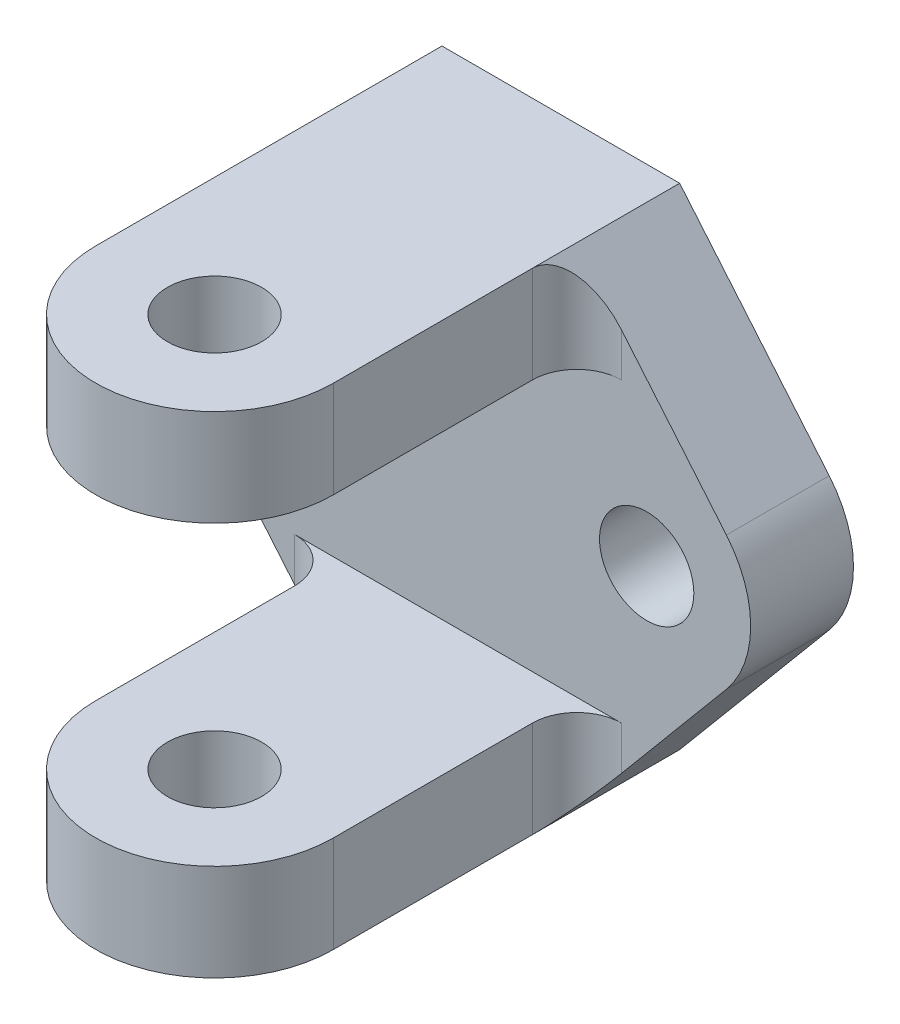
ISO-10303-21;
HEADER;
FILE_DESCRIPTION(('STEP AP214'),'2;1');
FILE_NAME('part.step','',(''),(''),'','','');
FILE_SCHEMA(('AUTOMOTIVE_DESIGN { 1 0 10303 214 1 1 1 1 }'));
ENDSEC;
DATA;
#1=APPLICATION_CONTEXT('core data for automotive mechanical design processes');
#2=APPLICATION_PROTOCOL_DEFINITION('international standard','automotive_design',2000,#1);
#3=PRODUCT_CONTEXT('',#1,'mechanical');
#4=PRODUCT('Part','Part','',(#3));
#5=PRODUCT_RELATED_PRODUCT_CATEGORY('part','',(#4));
#6=PRODUCT_DEFINITION_FORMATION('','',#4);
#7=PRODUCT_DEFINITION_CONTEXT('part definition',#1,'design');
#8=PRODUCT_DEFINITION('design','',#6,#7);
#9=PRODUCT_DEFINITION_SHAPE('','',#8);
#10=(LENGTH_UNIT() NAMED_UNIT(*) SI_UNIT(.MILLI.,.METRE.));
#11=(NAMED_UNIT(*) PLANE_ANGLE_UNIT() SI_UNIT($,.RADIAN.));
#12=(NAMED_UNIT(*) SI_UNIT($,.STERADIAN.) SOLID_ANGLE_UNIT());
#13=UNCERTAINTY_MEASURE_WITH_UNIT(LENGTH_MEASURE(1.E-05),#10,'distance_accuracy_value','');
#14=(GEOMETRIC_REPRESENTATION_CONTEXT(3) GLOBAL_UNCERTAINTY_ASSIGNED_CONTEXT((#13)) GLOBAL_UNIT_ASSIGNED_CONTEXT((#10,
#11,#12)) REPRESENTATION_CONTEXT('',''));
#15=CARTESIAN_POINT('',(0.,0.,0.));
#16=DIRECTION('',(0.,0.,1.));
#17=DIRECTION('',(1.,0.,0.));
#18=AXIS2_PLACEMENT_3D('',#15,#16,#17);
#19=CARTESIAN_POINT('',(-8.,-83.7629553253982,0.));
#20=DIRECTION('',(1.,0.,0.));
#21=DIRECTION('',(0.,0.,-1.));
#22=AXIS2_PLACEMENT_3D('',#19,#20,#21);
#23=PLANE('',#22);
#24=DIRECTION('',(0.,0.,1.));
#25=VECTOR('',#24,1.);
#26=CARTESIAN_POINT('',(-8.,16.51,0.));
#27=LINE('',#26,#25);
#28=CARTESIAN_POINT('',(-8.,16.51,12.46));
#29=VERTEX_POINT('',#28);
#30=CARTESIAN_POINT('',(-8.,16.51,25.8481308));
#31=VERTEX_POINT('',#30);
#32=EDGE_CURVE('E149',#29,#31,#27,.T.);
#33=ORIENTED_EDGE('',*,*,#32,.F.);
#34=DIRECTION('',(0.,1.,0.));
#35=VECTOR('',#34,1.);
#36=CARTESIAN_POINT('',(-8.,9.99999999999999,12.46));
#37=LINE('',#36,#35);
#38=CARTESIAN_POINT('',(-8.,10.,12.46));
#39=VERTEX_POINT('',#38);
#40=EDGE_CURVE('E142',#29,#39,#37,.F.);
#41=ORIENTED_EDGE('',*,*,#40,.T.);
#42=DIRECTION('',(0.,0.,-1.));
#43=VECTOR('',#42,1.);
#44=CARTESIAN_POINT('',(-7.99999999999999,10.,62.46));
#45=LINE('',#44,#43);
#46=CARTESIAN_POINT('',(-8.,9.99999999999999,25.8481308));
#47=VERTEX_POINT('',#46);
#48=EDGE_CURVE('E146',#47,#39,#45,.T.);
#49=ORIENTED_EDGE('',*,*,#48,.F.);
#50=DIRECTION('',(0.,1.,0.));
#51=VECTOR('',#50,1.);
#52=CARTESIAN_POINT('',(-8.,-83.7629553253982,25.8481308));
#53=LINE('',#52,#51);
#54=EDGE_CURVE('E295',#47,#31,#53,.T.);
#55=ORIENTED_EDGE('',*,*,#54,.T.);
#56=EDGE_LOOP('',(#33,#41,#49,#55));
#57=FACE_BOUND('',#56,.T.);
#58=ADVANCED_FACE('F42',(#57),#23,.F.);
#59=CARTESIAN_POINT('',(8.,-83.7629553253982,0.));
#60=DIRECTION('',(1.,0.,0.));
#61=DIRECTION('',(0.,0.,-1.));
#62=AXIS2_PLACEMENT_3D('',#59,#60,#61);
#63=PLANE('',#62);
#64=DIRECTION('',(0.,0.,-1.));
#65=VECTOR('',#64,1.);
#66=CARTESIAN_POINT('',(8.,10.,62.46));
#67=LINE('',#66,#65);
#68=CARTESIAN_POINT('',(8.,9.99999999999999,25.8481308));
#69=VERTEX_POINT('',#68);
#70=CARTESIAN_POINT('',(8.,10.,12.46));
#71=VERTEX_POINT('',#70);
#72=EDGE_CURVE('E165',#69,#71,#67,.T.);
#73=ORIENTED_EDGE('',*,*,#72,.T.);
#74=DIRECTION('',(0.,1.,0.));
#75=VECTOR('',#74,1.);
#76=CARTESIAN_POINT('',(8.,-83.7629553253982,12.46));
#77=LINE('',#76,#75);
#78=CARTESIAN_POINT('',(8.,16.51,12.46));
#79=VERTEX_POINT('',#78);
#80=EDGE_CURVE('E231',#71,#79,#77,.T.);
#81=ORIENTED_EDGE('',*,*,#80,.T.);
#82=DIRECTION('',(0.,0.,1.));
#83=VECTOR('',#82,1.);
#84=CARTESIAN_POINT('',(8.,16.51,0.));
#85=LINE('',#84,#83);
#86=CARTESIAN_POINT('',(8.,16.51,25.8481308));
#87=VERTEX_POINT('',#86);
#88=EDGE_CURVE('E292',#79,#87,#85,.T.);
#89=ORIENTED_EDGE('',*,*,#88,.T.);
#90=DIRECTION('',(0.,1.,0.));
#91=VECTOR('',#90,1.);
#92=CARTESIAN_POINT('',(8.,-83.7629553253982,25.8481308));
#93=LINE('',#92,#91);
#94=EDGE_CURVE('E308',#69,#87,#93,.T.);
#95=ORIENTED_EDGE('',*,*,#94,.F.);
#96=EDGE_LOOP('',(#73,#81,#89,#95));
#97=FACE_BOUND('',#96,.T.);
#98=ADVANCED_FACE('F375',(#97),#63,.T.);
#99=CARTESIAN_POINT('',(12.7,0.,44.8381062240477));
#100=DIRECTION('',(0.,0.,-1.));
#101=DIRECTION('',(-1.,0.,0.));
#102=AXIS2_PLACEMENT_3D('',#99,#100,#101);
#103=CYLINDRICAL_SURFACE('',#102,7.);
#104=CARTESIAN_POINT('',(12.7,0.,2.54));
#105=DIRECTION('',(0.,0.,1.));
#106=DIRECTION('',(1.,0.,0.));
#107=AXIS2_PLACEMENT_3D('',#104,#105,#106);
#108=CIRCLE('',#107,7.00000000000001);
#109=CARTESIAN_POINT('',(18.0657591468047,-4.49540084736414,2.54));
#110=VERTEX_POINT('',#109);
#111=CARTESIAN_POINT('',(18.0657591468047,4.49540084736415,2.54));
#112=VERTEX_POINT('',#111);
#113=EDGE_CURVE('E491',#110,#112,#108,.T.);
#114=ORIENTED_EDGE('',*,*,#113,.T.);
#115=DIRECTION('',(0.,0.,-1.));
#116=VECTOR('',#115,1.);
#117=CARTESIAN_POINT('',(18.0657591468047,4.49540084736414,25.1338667851937));
#118=LINE('',#117,#116);
#119=CARTESIAN_POINT('',(18.0657591468047,4.49540084736414,9.46));
#120=VERTEX_POINT('',#119);
#121=EDGE_CURVE('E208',#120,#112,#118,.T.);
#122=ORIENTED_EDGE('',*,*,#121,.F.);
#123=CARTESIAN_POINT('',(12.7,0.,9.46));
#124=DIRECTION('',(0.,0.,-1.));
#125=DIRECTION('',(-1.,0.,0.));
#126=AXIS2_PLACEMENT_3D('',#123,#124,#125);
#127=CIRCLE('',#126,7.);
#128=CARTESIAN_POINT('',(18.0657591468047,-4.49540084736414,9.46));
#129=VERTEX_POINT('',#128);
#130=EDGE_CURVE('E206',#129,#120,#127,.F.);
#131=ORIENTED_EDGE('',*,*,#130,.F.);
#132=DIRECTION('',(0.,0.,-1.));
#133=VECTOR('',#132,1.);
#134=CARTESIAN_POINT('',(18.0657591468047,-4.49540084736414,25.1338667851937));
#135=LINE('',#134,#133);
#136=EDGE_CURVE('E270',#129,#110,#135,.T.);
#137=ORIENTED_EDGE('',*,*,#136,.T.);
#138=EDGE_LOOP('',(#114,#122,#131,#137));
#139=FACE_BOUND('',#138,.T.);
#140=ADVANCED_FACE('F437',(#139),#103,.T.);
#141=DIRECTION('',(0.,0.,1.));
#142=VECTOR('',#141,1.);
#143=CARTESIAN_POINT('',(-7.99999999999999,-10.,62.46));
#144=LINE('',#143,#142);
#145=CARTESIAN_POINT('',(-8.,-10.,12.46));
#146=VERTEX_POINT('',#145);
#147=CARTESIAN_POINT('',(-8.,-10.,25.8481308));
#148=VERTEX_POINT('',#147);
#149=EDGE_CURVE('E243',#146,#148,#144,.T.);
#150=ORIENTED_EDGE('',*,*,#149,.F.);
#151=DIRECTION('',(0.,-1.,0.));
#152=VECTOR('',#151,1.);
#153=CARTESIAN_POINT('',(-8.,-16.51,12.46));
#154=LINE('',#153,#152);
#155=CARTESIAN_POINT('',(-8.,-16.51,12.46));
#156=VERTEX_POINT('',#155);
#157=EDGE_CURVE('E213',#146,#156,#154,.T.);
#158=ORIENTED_EDGE('',*,*,#157,.T.);
#159=DIRECTION('',(0.,0.,1.));
#160=VECTOR('',#159,1.);
#161=CARTESIAN_POINT('',(-8.,-16.51,0.));
#162=LINE('',#161,#160);
#163=CARTESIAN_POINT('',(-8.,-16.51,25.8481308));
#164=VERTEX_POINT('',#163);
#165=EDGE_CURVE('E303',#156,#164,#162,.T.);
#166=ORIENTED_EDGE('',*,*,#165,.T.);
#167=EDGE_CURVE('E254',#164,#148,#53,.T.);
#168=ORIENTED_EDGE('',*,*,#167,.T.);
#169=EDGE_LOOP('',(#150,#158,#166,#168));
#170=FACE_BOUND('',#169,.T.);
#171=ADVANCED_FACE('F250',(#170),#23,.F.);
#172=CARTESIAN_POINT('',(-12.7,0.,44.8381062240477));
#173=DIRECTION('',(0.,0.,-1.));
#174=DIRECTION('',(-1.,0.,0.));
#175=AXIS2_PLACEMENT_3D('',#172,#173,#174);
#176=CYLINDRICAL_SURFACE('',#175,7.);
#177=DIRECTION('',(0.,0.,-1.));
#178=VECTOR('',#177,1.);
#179=CARTESIAN_POINT('',(-18.0657591468047,4.49540084736414,25.1338667851937));
#180=LINE('',#179,#178);
#181=CARTESIAN_POINT('',(-18.0657591468047,4.49540084736414,9.46));
#182=VERTEX_POINT('',#181);
#183=CARTESIAN_POINT('',(-18.0657591468047,4.49540084736414,2.54));
#184=VERTEX_POINT('',#183);
#185=EDGE_CURVE('E209',#182,#184,#180,.T.);
#186=ORIENTED_EDGE('',*,*,#185,.T.);
#187=CARTESIAN_POINT('',(-12.7,0.,2.54));
#188=DIRECTION('',(0.,0.,1.));
#189=DIRECTION('',(1.,0.,0.));
#190=AXIS2_PLACEMENT_3D('',#187,#188,#189);
#191=CIRCLE('',#190,7.);
#192=CARTESIAN_POINT('',(-18.0657591468046,-4.49540084736414,2.54));
#193=VERTEX_POINT('',#192);
#194=EDGE_CURVE('E58',#184,#193,#191,.T.);
#195=ORIENTED_EDGE('',*,*,#194,.T.);
#196=DIRECTION('',(0.,0.,-1.));
#197=VECTOR('',#196,1.);
#198=CARTESIAN_POINT('',(-18.0657591468046,-4.49540084736414,25.1338667851937));
#199=LINE('',#198,#197);
#200=CARTESIAN_POINT('',(-18.0657591468046,-4.49540084736414,9.46));
#201=VERTEX_POINT('',#200);
#202=EDGE_CURVE('E111',#201,#193,#199,.T.);
#203=ORIENTED_EDGE('',*,*,#202,.F.);
#204=CARTESIAN_POINT('',(-12.7,0.,9.46));
#205=DIRECTION('',(0.,0.,-1.));
#206=DIRECTION('',(-1.,0.,0.));
#207=AXIS2_PLACEMENT_3D('',#204,#205,#206);
#208=CIRCLE('',#207,7.);
#209=EDGE_CURVE('E265',#201,#182,#208,.T.);
#210=ORIENTED_EDGE('',*,*,#209,.T.);
#211=EDGE_LOOP('',(#186,#195,#203,#210));
#212=FACE_BOUND('',#211,.T.);
#213=ADVANCED_FACE('F429',(#212),#176,.T.);
#214=DIRECTION('',(0.,0.,1.));
#215=VECTOR('',#214,1.);
#216=CARTESIAN_POINT('',(8.,-16.51,0.));
#217=LINE('',#216,#215);
#218=CARTESIAN_POINT('',(8.,-16.51,12.46));
#219=VERTEX_POINT('',#218);
#220=CARTESIAN_POINT('',(8.,-16.51,25.8481308));
#221=VERTEX_POINT('',#220);
#222=EDGE_CURVE('E299',#219,#221,#217,.T.);
#223=ORIENTED_EDGE('',*,*,#222,.F.);
#224=DIRECTION('',(0.,-1.,0.));
#225=VECTOR('',#224,1.);
#226=CARTESIAN_POINT('',(8.,-83.7629553253982,12.46));
#227=LINE('',#226,#225);
#228=CARTESIAN_POINT('',(8.,-9.99999999999999,12.46));
#229=VERTEX_POINT('',#228);
#230=EDGE_CURVE('E154',#219,#229,#227,.F.);
#231=ORIENTED_EDGE('',*,*,#230,.T.);
#232=DIRECTION('',(0.,0.,1.));
#233=VECTOR('',#232,1.);
#234=CARTESIAN_POINT('',(8.,-9.99999999999999,62.46));
#235=LINE('',#234,#233);
#236=CARTESIAN_POINT('',(8.,-9.99999999999999,25.8481308));
#237=VERTEX_POINT('',#236);
#238=EDGE_CURVE('E220',#229,#237,#235,.T.);
#239=ORIENTED_EDGE('',*,*,#238,.T.);
#240=EDGE_CURVE('E304',#221,#237,#93,.T.);
#241=ORIENTED_EDGE('',*,*,#240,.F.);
#242=EDGE_LOOP('',(#223,#231,#239,#241));
#243=FACE_BOUND('',#242,.T.);
#244=ADVANCED_FACE('F351',(#243),#63,.T.);
#245=CARTESIAN_POINT('',(-20.7,10.,62.46));
#246=DIRECTION('',(0.,1.,0.));
#247=DIRECTION('',(0.,0.,1.));
#248=AXIS2_PLACEMENT_3D('',#245,#246,#247);
#249=PLANE('',#248);
#250=CARTESIAN_POINT('',(0.,10.,25.8481308));
#251=DIRECTION('',(0.,1.,0.));
#252=DIRECTION('',(0.,0.,1.));
#253=AXIS2_PLACEMENT_3D('',#250,#251,#252);
#254=CIRCLE('',#253,3.175);
#255=CARTESIAN_POINT('',(0.,10.,29.0231308));
#256=VERTEX_POINT('',#255);
#257=EDGE_CURVE('E326',#256,#256,#254,.T.);
#258=ORIENTED_EDGE('',*,*,#257,.T.);
#259=EDGE_LOOP('',(#258));
#260=FACE_BOUND('',#259,.T.);
#261=ORIENTED_EDGE('',*,*,#72,.F.);
#262=CARTESIAN_POINT('',(0.,9.99999999999999,25.8481308));
#263=DIRECTION('',(0.,1.,0.));
#264=DIRECTION('',(0.,0.,1.));
#265=AXIS2_PLACEMENT_3D('',#262,#263,#264);
#266=CIRCLE('',#265,8.);
#267=EDGE_CURVE('E163',#47,#69,#266,.T.);
#268=ORIENTED_EDGE('',*,*,#267,.F.);
#269=ORIENTED_EDGE('',*,*,#48,.T.);
#270=CARTESIAN_POINT('',(-11.,10.,12.46));
#271=DIRECTION('',(0.,1.,0.));
#272=DIRECTION('',(0.,0.,1.));
#273=AXIS2_PLACEMENT_3D('',#270,#271,#272);
#274=CIRCLE('',#273,3.);
#275=CARTESIAN_POINT('',(-11.,10.,9.46));
#276=VERTEX_POINT('',#275);
#277=EDGE_CURVE('E160',#39,#276,#274,.T.);
#278=ORIENTED_EDGE('',*,*,#277,.T.);
#279=DIRECTION('',(1.,0.,0.));
#280=VECTOR('',#279,1.);
#281=CARTESIAN_POINT('',(-20.7,10.,9.46));
#282=LINE('',#281,#280);
#283=CARTESIAN_POINT('',(11.,10.,9.46));
#284=VERTEX_POINT('',#283);
#285=EDGE_CURVE('E332',#276,#284,#282,.T.);
#286=ORIENTED_EDGE('',*,*,#285,.T.);
#287=CARTESIAN_POINT('',(11.,9.99999999999999,12.46));
#288=DIRECTION('',(0.,1.,0.));
#289=DIRECTION('',(0.,0.,1.));
#290=AXIS2_PLACEMENT_3D('',#287,#288,#289);
#291=CIRCLE('',#290,3.);
#292=EDGE_CURVE('E11',#284,#71,#291,.T.);
#293=ORIENTED_EDGE('',*,*,#292,.T.);
#294=EDGE_LOOP('',(#261,#268,#269,#278,#286,#293));
#295=FACE_BOUND('',#294,.T.);
#296=ADVANCED_FACE('F159',(#260,#295),#249,.F.);
#297=CARTESIAN_POINT('',(-20.7,-10.,62.46));
#298=DIRECTION('',(0.,-1.,0.));
#299=DIRECTION('',(1.,0.,0.));
#300=AXIS2_PLACEMENT_3D('',#297,#298,#299);
#301=PLANE('',#300);
#302=CARTESIAN_POINT('',(0.,-9.99999999999999,25.8481308));
#303=DIRECTION('',(0.,-1.,0.));
#304=DIRECTION('',(1.,0.,0.));
#305=AXIS2_PLACEMENT_3D('',#302,#303,#304);
#306=CIRCLE('',#305,3.175);
#307=CARTESIAN_POINT('',(0.,-9.99999999999999,29.0231308));
#308=VERTEX_POINT('',#307);
#309=EDGE_CURVE('E325',#308,#308,#306,.T.);
#310=ORIENTED_EDGE('',*,*,#309,.T.);
#311=EDGE_LOOP('',(#310));
#312=FACE_BOUND('',#311,.T.);
#313=ORIENTED_EDGE('',*,*,#238,.F.);
#314=CARTESIAN_POINT('',(11.,-9.99999999999999,12.46));
#315=DIRECTION('',(0.,-1.,0.));
#316=DIRECTION('',(1.,0.,0.));
#317=AXIS2_PLACEMENT_3D('',#314,#315,#316);
#318=CIRCLE('',#317,3.);
#319=CARTESIAN_POINT('',(11.,-9.99999999999999,9.46));
#320=VERTEX_POINT('',#319);
#321=EDGE_CURVE('E177',#229,#320,#318,.T.);
#322=ORIENTED_EDGE('',*,*,#321,.T.);
#323=DIRECTION('',(-1.,0.,0.));
#324=VECTOR('',#323,1.);
#325=CARTESIAN_POINT('',(-20.7,-10.,9.46));
#326=LINE('',#325,#324);
#327=CARTESIAN_POINT('',(-11.,-10.,9.46));
#328=VERTEX_POINT('',#327);
#329=EDGE_CURVE('E245',#320,#328,#326,.T.);
#330=ORIENTED_EDGE('',*,*,#329,.T.);
#331=CARTESIAN_POINT('',(-11.,-10.,12.46));
#332=DIRECTION('',(0.,-1.,0.));
#333=DIRECTION('',(1.,0.,0.));
#334=AXIS2_PLACEMENT_3D('',#331,#332,#333);
#335=CIRCLE('',#334,3.);
#336=EDGE_CURVE('E179',#328,#146,#335,.T.);
#337=ORIENTED_EDGE('',*,*,#336,.T.);
#338=ORIENTED_EDGE('',*,*,#149,.T.);
#339=CARTESIAN_POINT('',(0.,-9.99999999999999,25.8481308));
#340=DIRECTION('',(0.,-1.,0.));
#341=DIRECTION('',(1.,0.,0.));
#342=AXIS2_PLACEMENT_3D('',#339,#340,#341);
#343=CIRCLE('',#342,8.);
#344=EDGE_CURVE('E257',#237,#148,#343,.T.);
#345=ORIENTED_EDGE('',*,*,#344,.F.);
#346=EDGE_LOOP('',(#313,#322,#330,#337,#338,#345));
#347=FACE_BOUND('',#346,.T.);
#348=ADVANCED_FACE('F241',(#312,#347),#301,.F.);
#349=CARTESIAN_POINT('',(0.,0.,9.46));
#350=DIRECTION('',(0.,0.,-1.));
#351=DIRECTION('',(-1.,0.,0.));
#352=AXIS2_PLACEMENT_3D('',#349,#350,#351);
#353=PLANE('',#352);
#354=DIRECTION('',(0.64220012105202,-0.766537020972093,0.));
#355=VECTOR('',#354,1.);
#356=CARTESIAN_POINT('',(-12.8280125042184,-10.7472319766351,9.46));
#357=LINE('',#356,#355);
#358=CARTESIAN_POINT('',(-11.,-12.9291675031933,9.46));
#359=VERTEX_POINT('',#358);
#360=EDGE_CURVE('E263',#201,#359,#357,.T.);
#361=ORIENTED_EDGE('',*,*,#360,.T.);
#362=DIRECTION('',(0.,-1.,0.));
#363=VECTOR('',#362,1.);
#364=CARTESIAN_POINT('',(-11.,-9.99999999999999,9.46));
#365=LINE('',#364,#363);
#366=EDGE_CURVE('E155',#359,#328,#365,.F.);
#367=ORIENTED_EDGE('',*,*,#366,.T.);
#368=ORIENTED_EDGE('',*,*,#329,.F.);
#369=DIRECTION('',(0.,-1.,0.));
#370=VECTOR('',#369,1.);
#371=CARTESIAN_POINT('',(11.,0.,9.46));
#372=LINE('',#371,#370);
#373=CARTESIAN_POINT('',(11.,-12.9291675031933,9.46));
#374=VERTEX_POINT('',#373);
#375=EDGE_CURVE('E212',#320,#374,#372,.T.);
#376=ORIENTED_EDGE('',*,*,#375,.T.);
#377=DIRECTION('',(-0.64220012105202,-0.766537020972093,0.));
#378=VECTOR('',#377,1.);
#379=CARTESIAN_POINT('',(12.8280125042185,-10.7472319766351,9.46));
#380=LINE('',#379,#378);
#381=EDGE_CURVE('E274',#129,#374,#380,.T.);
#382=ORIENTED_EDGE('',*,*,#381,.F.);
#383=ORIENTED_EDGE('',*,*,#130,.T.);
#384=DIRECTION('',(-0.64220012105202,0.766537020972093,0.));
#385=VECTOR('',#384,1.);
#386=CARTESIAN_POINT('',(8.,16.51,9.46));
#387=LINE('',#386,#385);
#388=CARTESIAN_POINT('',(11.,12.9291675031933,9.46));
#389=VERTEX_POINT('',#388);
#390=EDGE_CURVE('E191',#120,#389,#387,.T.);
#391=ORIENTED_EDGE('',*,*,#390,.T.);
#392=DIRECTION('',(0.,1.,0.));
#393=VECTOR('',#392,1.);
#394=CARTESIAN_POINT('',(11.,0.,9.46));
#395=LINE('',#394,#393);
#396=EDGE_CURVE('E203',#389,#284,#395,.F.);
#397=ORIENTED_EDGE('',*,*,#396,.T.);
#398=ORIENTED_EDGE('',*,*,#285,.F.);
#399=DIRECTION('',(0.,1.,0.));
#400=VECTOR('',#399,1.);
#401=CARTESIAN_POINT('',(-11.,16.51,9.46));
#402=LINE('',#401,#400);
#403=CARTESIAN_POINT('',(-11.,12.9291675031933,9.46));
#404=VERTEX_POINT('',#403);
#405=EDGE_CURVE('E169',#276,#404,#402,.T.);
#406=ORIENTED_EDGE('',*,*,#405,.T.);
#407=DIRECTION('',(0.64220012105202,0.766537020972093,0.));
#408=VECTOR('',#407,1.);
#409=CARTESIAN_POINT('',(-8.,16.51,9.46));
#410=LINE('',#409,#408);
#411=EDGE_CURVE('E423',#182,#404,#410,.T.);
#412=ORIENTED_EDGE('',*,*,#411,.F.);
#413=ORIENTED_EDGE('',*,*,#209,.F.);
#414=EDGE_LOOP('',(#361,#367,#368,#376,#382,#383,#391,#397,#398,#406,#412,#413));
#415=FACE_BOUND('',#414,.T.);
#416=CARTESIAN_POINT('',(12.7,0.,9.46));
#417=DIRECTION('',(0.,0.,1.));
#418=DIRECTION('',(1.,0.,0.));
#419=AXIS2_PLACEMENT_3D('',#416,#417,#418);
#420=CIRCLE('',#419,3.175);
#421=CARTESIAN_POINT('',(15.875,0.,9.46));
#422=VERTEX_POINT('',#421);
#423=EDGE_CURVE('E258',#422,#422,#420,.T.);
#424=ORIENTED_EDGE('',*,*,#423,.F.);
#425=EDGE_LOOP('',(#424));
#426=FACE_BOUND('',#425,.T.);
#427=CARTESIAN_POINT('',(-12.7,0.,9.46));
#428=DIRECTION('',(0.,0.,1.));
#429=DIRECTION('',(1.,0.,0.));
#430=AXIS2_PLACEMENT_3D('',#427,#428,#429);
#431=CIRCLE('',#430,3.175);
#432=CARTESIAN_POINT('',(-9.525,0.,9.46));
#433=VERTEX_POINT('',#432);
#434=EDGE_CURVE('E335',#433,#433,#431,.T.);
#435=ORIENTED_EDGE('',*,*,#434,.F.);
#436=EDGE_LOOP('',(#435));
#437=FACE_BOUND('',#436,.T.);
#438=ADVANCED_FACE('F201',(#415,#426,#437),#353,.F.);
#439=CARTESIAN_POINT('',(-20.7,16.51,9.46));
#440=DIRECTION('',(0.,-1.,0.));
#441=DIRECTION('',(0.,0.,-1.));
#442=AXIS2_PLACEMENT_3D('',#439,#440,#441);
#443=PLANE('',#442);
#444=CARTESIAN_POINT('',(0.,16.51,25.8481308));
#445=DIRECTION('',(0.,-1.,0.));
#446=DIRECTION('',(0.,0.,-1.));
#447=AXIS2_PLACEMENT_3D('',#444,#445,#446);
#448=CIRCLE('',#447,3.175);
#449=CARTESIAN_POINT('',(0.,16.51,29.0231308));
#450=VERTEX_POINT('',#449);
#451=EDGE_CURVE('E317',#450,#450,#448,.T.);
#452=ORIENTED_EDGE('',*,*,#451,.T.);
#453=EDGE_LOOP('',(#452));
#454=FACE_BOUND('',#453,.T.);
#455=CARTESIAN_POINT('',(8.,16.51,2.54));
#456=VERTEX_POINT('',#455);
#457=EDGE_CURVE('E79',#456,#79,#85,.T.);
#458=ORIENTED_EDGE('',*,*,#457,.F.);
#459=DIRECTION('',(-1.,0.,0.));
#460=VECTOR('',#459,1.);
#461=CARTESIAN_POINT('',(8.,16.51,2.54));
#462=LINE('',#461,#460);
#463=CARTESIAN_POINT('',(-8.,16.51,2.54));
#464=VERTEX_POINT('',#463);
#465=EDGE_CURVE('E413',#456,#464,#462,.T.);
#466=ORIENTED_EDGE('',*,*,#465,.T.);
#467=EDGE_CURVE('E285',#464,#29,#27,.T.);
#468=ORIENTED_EDGE('',*,*,#467,.T.);
#469=ORIENTED_EDGE('',*,*,#32,.T.);
#470=CARTESIAN_POINT('',(0.,16.51,25.8481308));
#471=DIRECTION('',(0.,-1.,0.));
#472=DIRECTION('',(0.,0.,-1.));
#473=AXIS2_PLACEMENT_3D('',#470,#471,#472);
#474=CIRCLE('',#473,8.);
#475=EDGE_CURVE('E288',#87,#31,#474,.T.);
#476=ORIENTED_EDGE('',*,*,#475,.F.);
#477=ORIENTED_EDGE('',*,*,#88,.F.);
#478=EDGE_LOOP('',(#458,#466,#468,#469,#476,#477));
#479=FACE_BOUND('',#478,.T.);
#480=ADVANCED_FACE('F383',(#454,#479),#443,.F.);
#481=CARTESIAN_POINT('',(-20.7,-16.51,9.46));
#482=DIRECTION('',(0.,1.,0.));
#483=DIRECTION('',(0.,0.,1.));
#484=AXIS2_PLACEMENT_3D('',#481,#482,#483);
#485=PLANE('',#484);
#486=CARTESIAN_POINT('',(-8.,-16.51,2.54));
#487=VERTEX_POINT('',#486);
#488=EDGE_CURVE('E100',#487,#156,#162,.T.);
#489=ORIENTED_EDGE('',*,*,#488,.F.);
#490=DIRECTION('',(1.,0.,0.));
#491=VECTOR('',#490,1.);
#492=CARTESIAN_POINT('',(-8.,-16.51,2.54));
#493=LINE('',#492,#491);
#494=CARTESIAN_POINT('',(8.,-16.51,2.54));
#495=VERTEX_POINT('',#494);
#496=EDGE_CURVE('E754',#487,#495,#493,.T.);
#497=ORIENTED_EDGE('',*,*,#496,.T.);
#498=EDGE_CURVE('E67',#495,#219,#217,.T.);
#499=ORIENTED_EDGE('',*,*,#498,.T.);
#500=ORIENTED_EDGE('',*,*,#222,.T.);
#501=CARTESIAN_POINT('',(0.,-16.51,25.8481308));
#502=DIRECTION('',(0.,1.,0.));
#503=DIRECTION('',(0.,0.,1.));
#504=AXIS2_PLACEMENT_3D('',#501,#502,#503);
#505=CIRCLE('',#504,8.);
#506=EDGE_CURVE('E298',#221,#164,#505,.F.);
#507=ORIENTED_EDGE('',*,*,#506,.T.);
#508=ORIENTED_EDGE('',*,*,#165,.F.);
#509=EDGE_LOOP('',(#489,#497,#499,#500,#507,#508));
#510=FACE_BOUND('',#509,.T.);
#511=CARTESIAN_POINT('',(0.,-16.51,25.8481308));
#512=DIRECTION('',(0.,1.,0.));
#513=DIRECTION('',(0.,0.,1.));
#514=AXIS2_PLACEMENT_3D('',#511,#512,#513);
#515=CIRCLE('',#514,3.175);
#516=CARTESIAN_POINT('',(0.,-16.51,29.0231308));
#517=VERTEX_POINT('',#516);
#518=EDGE_CURVE('E321',#517,#517,#515,.F.);
#519=ORIENTED_EDGE('',*,*,#518,.F.);
#520=EDGE_LOOP('',(#519));
#521=FACE_BOUND('',#520,.T.);
#522=ADVANCED_FACE('F362',(#510,#521),#485,.F.);
#523=CARTESIAN_POINT('',(12.7,0.,9.46));
#524=DIRECTION('',(0.,0.,-1.));
#525=DIRECTION('',(-1.,0.,0.));
#526=AXIS2_PLACEMENT_3D('',#523,#524,#525);
#527=CYLINDRICAL_SURFACE('',#526,3.175);
#528=CARTESIAN_POINT('',(12.7,0.,2.54));
#529=DIRECTION('',(0.,0.,1.));
#530=DIRECTION('',(1.,0.,0.));
#531=AXIS2_PLACEMENT_3D('',#528,#529,#530);
#532=CIRCLE('',#531,3.175);
#533=CARTESIAN_POINT('',(15.875,0.,2.54));
#534=VERTEX_POINT('',#533);
#535=EDGE_CURVE('E425',#534,#534,#532,.T.);
#536=ORIENTED_EDGE('',*,*,#535,.F.);
#537=EDGE_LOOP('',(#536));
#538=FACE_BOUND('',#537,.T.);
#539=ORIENTED_EDGE('',*,*,#423,.T.);
#540=EDGE_LOOP('',(#539));
#541=FACE_BOUND('',#540,.T.);
#542=ADVANCED_FACE('F463',(#538,#541),#527,.F.);
#543=CARTESIAN_POINT('',(-12.7,0.,9.46));
#544=DIRECTION('',(0.,0.,-1.));
#545=DIRECTION('',(-1.,0.,0.));
#546=AXIS2_PLACEMENT_3D('',#543,#544,#545);
#547=CYLINDRICAL_SURFACE('',#546,3.175);
#548=CARTESIAN_POINT('',(-12.7,0.,2.54));
#549=DIRECTION('',(0.,0.,1.));
#550=DIRECTION('',(1.,0.,0.));
#551=AXIS2_PLACEMENT_3D('',#548,#549,#550);
#552=CIRCLE('',#551,3.175);
#553=CARTESIAN_POINT('',(-9.525,0.,2.54));
#554=VERTEX_POINT('',#553);
#555=EDGE_CURVE('E494',#554,#554,#552,.T.);
#556=ORIENTED_EDGE('',*,*,#555,.F.);
#557=EDGE_LOOP('',(#556));
#558=FACE_BOUND('',#557,.T.);
#559=ORIENTED_EDGE('',*,*,#434,.T.);
#560=EDGE_LOOP('',(#559));
#561=FACE_BOUND('',#560,.T.);
#562=ADVANCED_FACE('F460',(#558,#561),#547,.F.);
#563=CARTESIAN_POINT('',(0.,-25.4902561210691,25.8481308));
#564=DIRECTION('',(0.,1.,0.));
#565=DIRECTION('',(0.,0.,1.));
#566=AXIS2_PLACEMENT_3D('',#563,#564,#565);
#567=CYLINDRICAL_SURFACE('',#566,3.175);
#568=CARTESIAN_POINT('',(0.,-16.51,29.0231308));
#569=CARTESIAN_POINT('',(0.,-16.4421875,29.0231308));
#570=CARTESIAN_POINT('',(0.,-16.374375,29.0231308));
#571=CARTESIAN_POINT('',(0.,-16.23875,29.0231308));
#572=CARTESIAN_POINT('',(0.,-16.1709375,29.0231308));
#573=CARTESIAN_POINT('',(0.,-16.0353125,29.0231308));
#574=CARTESIAN_POINT('',(0.,-15.9675,29.0231308));
#575=CARTESIAN_POINT('',(0.,-15.831875,29.0231308));
#576=CARTESIAN_POINT('',(0.,-15.7640625,29.0231308));
#577=CARTESIAN_POINT('',(0.,-15.6284375,29.0231308));
#578=CARTESIAN_POINT('',(0.,-15.560625,29.0231308));
#579=CARTESIAN_POINT('',(0.,-15.425,29.0231308));
#580=CARTESIAN_POINT('',(0.,-15.3571875,29.0231308));
#581=CARTESIAN_POINT('',(0.,-15.2215625,29.0231308));
#582=CARTESIAN_POINT('',(0.,-15.15375,29.0231308));
#583=CARTESIAN_POINT('',(0.,-15.018125,29.0231308));
#584=CARTESIAN_POINT('',(0.,-14.9503125,29.0231308));
#585=CARTESIAN_POINT('',(0.,-14.8146875,29.0231308));
#586=CARTESIAN_POINT('',(0.,-14.746875,29.0231308));
#587=CARTESIAN_POINT('',(0.,-14.61125,29.0231308));
#588=CARTESIAN_POINT('',(0.,-14.5434375,29.0231308));
#589=CARTESIAN_POINT('',(0.,-14.4078125,29.0231308));
#590=CARTESIAN_POINT('',(0.,-14.34,29.0231308));
#591=CARTESIAN_POINT('',(0.,-14.204375,29.0231308));
#592=CARTESIAN_POINT('',(0.,-14.1365625,29.0231308));
#593=CARTESIAN_POINT('',(0.,-14.0009375,29.0231308));
#594=CARTESIAN_POINT('',(0.,-13.933125,29.0231308));
#595=CARTESIAN_POINT('',(0.,-13.7975,29.0231308));
#596=CARTESIAN_POINT('',(0.,-13.7296875,29.0231308));
#597=CARTESIAN_POINT('',(0.,-13.5940625,29.0231308));
#598=CARTESIAN_POINT('',(0.,-13.52625,29.0231308));
#599=CARTESIAN_POINT('',(0.,-13.390625,29.0231308));
#600=CARTESIAN_POINT('',(0.,-13.3228125,29.0231308));
#601=CARTESIAN_POINT('',(0.,-13.1871875,29.0231308));
#602=CARTESIAN_POINT('',(0.,-13.119375,29.0231308));
#603=CARTESIAN_POINT('',(0.,-12.98375,29.0231308));
#604=CARTESIAN_POINT('',(0.,-12.9159375,29.0231308));
#605=CARTESIAN_POINT('',(0.,-12.7803125,29.0231308));
#606=CARTESIAN_POINT('',(0.,-12.7125,29.0231308));
#607=CARTESIAN_POINT('',(0.,-12.576875,29.0231308));
#608=CARTESIAN_POINT('',(0.,-12.5090625,29.0231308));
#609=CARTESIAN_POINT('',(0.,-12.3734375,29.0231308));
#610=CARTESIAN_POINT('',(0.,-12.305625,29.0231308));
#611=CARTESIAN_POINT('',(0.,-12.17,29.0231308));
#612=CARTESIAN_POINT('',(0.,-12.1021875,29.0231308));
#613=CARTESIAN_POINT('',(0.,-11.9665625,29.0231308));
#614=CARTESIAN_POINT('',(0.,-11.89875,29.0231308));
#615=CARTESIAN_POINT('',(0.,-11.763125,29.0231308));
#616=CARTESIAN_POINT('',(0.,-11.6953125,29.0231308));
#617=CARTESIAN_POINT('',(0.,-11.5596875,29.0231308));
#618=CARTESIAN_POINT('',(0.,-11.491875,29.0231308));
#619=CARTESIAN_POINT('',(0.,-11.35625,29.0231308));
#620=CARTESIAN_POINT('',(0.,-11.2884375,29.0231308));
#621=CARTESIAN_POINT('',(0.,-11.1528125,29.0231308));
#622=CARTESIAN_POINT('',(0.,-11.085,29.0231308));
#623=CARTESIAN_POINT('',(0.,-10.949375,29.0231308));
#624=CARTESIAN_POINT('',(0.,-10.8815625,29.0231308));
#625=CARTESIAN_POINT('',(0.,-10.7459375,29.0231308));
#626=CARTESIAN_POINT('',(0.,-10.678125,29.0231308));
#627=CARTESIAN_POINT('',(0.,-10.5425,29.0231308));
#628=CARTESIAN_POINT('',(0.,-10.4746875,29.0231308));
#629=CARTESIAN_POINT('',(0.,-10.3390625,29.0231308));
#630=CARTESIAN_POINT('',(0.,-10.27125,29.0231308));
#631=CARTESIAN_POINT('',(0.,-10.135625,29.0231308));
#632=CARTESIAN_POINT('',(0.,-10.0678125,29.0231308));
#633=CARTESIAN_POINT('',(0.,-9.99999999999999,29.0231308));
#634=B_SPLINE_CURVE_WITH_KNOTS('',3,(#568,#569,#570,#571,#572,#573,#574,#575,#576,#577,#578,
#579,#580,#581,#582,#583,#584,#585,#586,#587,#588,#589,#590,#591,#592,#593,#594,#595,#596,#597,
#598,#599,#600,#601,#602,#603,#604,#605,#606,#607,#608,#609,#610,#611,#612,#613,#614,#615,#616,
#617,#618,#619,#620,#621,#622,#623,#624,#625,#626,#627,#628,#629,#630,#631,#632,#633),
.UNSPECIFIED.,.F.,.F.,(4,2,2,2,2,2,2,2,2,2,2,2,2,2,2,2,2,2,2,2,2,2,2,2,2,2,2,2,2,2,2,2,4),(0.,
0.2034375,0.406875000000001,0.610312500000001,0.813750000000002,1.0171875,1.220625,1.4240625,
1.6275,1.8309375,2.03437500000001,2.2378125,2.44125,2.6446875,2.84812500000001,3.05156250000001,
3.25500000000001,3.45843750000001,3.66187500000001,3.86531250000001,4.06875000000001,
4.27218750000001,4.47562500000001,4.67906250000001,4.88250000000001,5.08593750000001,
5.28937500000001,5.49281250000001,5.69625000000001,5.89968750000001,6.10312500000001,
6.30656250000001,6.51000000000001),.UNSPECIFIED.);
#635=EDGE_CURVE('BSEAM452',#517,#308,#634,.T.);
#636=ORIENTED_EDGE('',*,*,#518,.T.);
#637=ORIENTED_EDGE('',*,*,#309,.F.);
#638=ORIENTED_EDGE('',*,*,#635,.T.);
#639=ORIENTED_EDGE('',*,*,#635,.F.);
#640=EDGE_LOOP('',(#636,#638,#637,#639));
#641=FACE_BOUND('',#640,.T.);
#642=ADVANCED_FACE('F452',(#641),#567,.F.);
#643=CARTESIAN_POINT('',(0.,16.51,29.0231308));
#644=CARTESIAN_POINT('',(0.,16.4421875,29.0231308));
#645=CARTESIAN_POINT('',(0.,16.374375,29.0231308));
#646=CARTESIAN_POINT('',(0.,16.23875,29.0231308));
#647=CARTESIAN_POINT('',(0.,16.1709375,29.0231308));
#648=CARTESIAN_POINT('',(0.,16.0353125,29.0231308));
#649=CARTESIAN_POINT('',(0.,15.9675,29.0231308));
#650=CARTESIAN_POINT('',(0.,15.831875,29.0231308));
#651=CARTESIAN_POINT('',(0.,15.7640625,29.0231308));
#652=CARTESIAN_POINT('',(0.,15.6284375,29.0231308));
#653=CARTESIAN_POINT('',(0.,15.560625,29.0231308));
#654=CARTESIAN_POINT('',(0.,15.425,29.0231308));
#655=CARTESIAN_POINT('',(0.,15.3571875,29.0231308));
#656=CARTESIAN_POINT('',(0.,15.2215625,29.0231308));
#657=CARTESIAN_POINT('',(0.,15.15375,29.0231308));
#658=CARTESIAN_POINT('',(0.,15.018125,29.0231308));
#659=CARTESIAN_POINT('',(0.,14.9503125,29.0231308));
#660=CARTESIAN_POINT('',(0.,14.8146875,29.0231308));
#661=CARTESIAN_POINT('',(0.,14.746875,29.0231308));
#662=CARTESIAN_POINT('',(0.,14.61125,29.0231308));
#663=CARTESIAN_POINT('',(0.,14.5434375,29.0231308));
#664=CARTESIAN_POINT('',(0.,14.4078125,29.0231308));
#665=CARTESIAN_POINT('',(0.,14.34,29.0231308));
#666=CARTESIAN_POINT('',(0.,14.204375,29.0231308));
#667=CARTESIAN_POINT('',(0.,14.1365625,29.0231308));
#668=CARTESIAN_POINT('',(0.,14.0009375,29.0231308));
#669=CARTESIAN_POINT('',(0.,13.933125,29.0231308));
#670=CARTESIAN_POINT('',(0.,13.7975,29.0231308));
#671=CARTESIAN_POINT('',(0.,13.7296875,29.0231308));
#672=CARTESIAN_POINT('',(0.,13.5940625,29.0231308));
#673=CARTESIAN_POINT('',(0.,13.52625,29.0231308));
#674=CARTESIAN_POINT('',(0.,13.390625,29.0231308));
#675=CARTESIAN_POINT('',(0.,13.3228125,29.0231308));
#676=CARTESIAN_POINT('',(0.,13.1871875,29.0231308));
#677=CARTESIAN_POINT('',(0.,13.119375,29.0231308));
#678=CARTESIAN_POINT('',(0.,12.98375,29.0231308));
#679=CARTESIAN_POINT('',(0.,12.9159375,29.0231308));
#680=CARTESIAN_POINT('',(0.,12.7803125,29.0231308));
#681=CARTESIAN_POINT('',(0.,12.7125,29.0231308));
#682=CARTESIAN_POINT('',(0.,12.576875,29.0231308));
#683=CARTESIAN_POINT('',(0.,12.5090625,29.0231308));
#684=CARTESIAN_POINT('',(0.,12.3734375,29.0231308));
#685=CARTESIAN_POINT('',(0.,12.305625,29.0231308));
#686=CARTESIAN_POINT('',(0.,12.17,29.0231308));
#687=CARTESIAN_POINT('',(0.,12.1021875,29.0231308));
#688=CARTESIAN_POINT('',(0.,11.9665625,29.0231308));
#689=CARTESIAN_POINT('',(0.,11.89875,29.0231308));
#690=CARTESIAN_POINT('',(0.,11.763125,29.0231308));
#691=CARTESIAN_POINT('',(0.,11.6953125,29.0231308));
#692=CARTESIAN_POINT('',(0.,11.5596875,29.0231308));
#693=CARTESIAN_POINT('',(0.,11.491875,29.0231308));
#694=CARTESIAN_POINT('',(0.,11.35625,29.0231308));
#695=CARTESIAN_POINT('',(0.,11.2884375,29.0231308));
#696=CARTESIAN_POINT('',(0.,11.1528125,29.0231308));
#697=CARTESIAN_POINT('',(0.,11.085,29.0231308));
#698=CARTESIAN_POINT('',(0.,10.949375,29.0231308));
#699=CARTESIAN_POINT('',(0.,10.8815625,29.0231308));
#700=CARTESIAN_POINT('',(0.,10.7459375,29.0231308));
#701=CARTESIAN_POINT('',(0.,10.678125,29.0231308));
#702=CARTESIAN_POINT('',(0.,10.5425,29.0231308));
#703=CARTESIAN_POINT('',(0.,10.4746875,29.0231308));
#704=CARTESIAN_POINT('',(0.,10.3390625,29.0231308));
#705=CARTESIAN_POINT('',(0.,10.27125,29.0231308));
#706=CARTESIAN_POINT('',(0.,10.135625,29.0231308));
#707=CARTESIAN_POINT('',(0.,10.0678125,29.0231308));
#708=CARTESIAN_POINT('',(0.,10.,29.0231308));
#709=B_SPLINE_CURVE_WITH_KNOTS('',3,(#643,#644,#645,#646,#647,#648,#649,#650,#651,#652,#653,
#654,#655,#656,#657,#658,#659,#660,#661,#662,#663,#664,#665,#666,#667,#668,#669,#670,#671,#672,
#673,#674,#675,#676,#677,#678,#679,#680,#681,#682,#683,#684,#685,#686,#687,#688,#689,#690,#691,
#692,#693,#694,#695,#696,#697,#698,#699,#700,#701,#702,#703,#704,#705,#706,#707,#708),
.UNSPECIFIED.,.F.,.F.,(4,2,2,2,2,2,2,2,2,2,2,2,2,2,2,2,2,2,2,2,2,2,2,2,2,2,2,2,2,2,2,2,4),(0.,
0.2034375,0.406875000000001,0.610312500000001,0.813750000000002,1.0171875,1.220625,1.4240625,
1.6275,1.8309375,2.034375,2.2378125,2.44125,2.6446875,2.848125,3.0515625,3.255,3.4584375,
3.661875,3.8653125,4.06875,4.2721875,4.475625,4.6790625,4.8825,5.0859375,5.289375,5.4928125,
5.69625,5.8996875,6.103125,6.3065625,6.51),.UNSPECIFIED.);
#710=EDGE_CURVE('BSEAM449',#450,#256,#709,.T.);
#711=ORIENTED_EDGE('',*,*,#451,.F.);
#712=ORIENTED_EDGE('',*,*,#257,.F.);
#713=ORIENTED_EDGE('',*,*,#710,.T.);
#714=ORIENTED_EDGE('',*,*,#710,.F.);
#715=EDGE_LOOP('',(#711,#713,#712,#714));
#716=FACE_BOUND('',#715,.T.);
#717=ADVANCED_FACE('F449',(#716),#567,.F.);
#718=CARTESIAN_POINT('',(0.,-83.7629553253982,25.8481308));
#719=DIRECTION('',(0.,1.,0.));
#720=DIRECTION('',(0.,0.,1.));
#721=AXIS2_PLACEMENT_3D('',#718,#719,#720);
#722=CYLINDRICAL_SURFACE('',#721,8.);
#723=ORIENTED_EDGE('',*,*,#344,.T.);
#724=ORIENTED_EDGE('',*,*,#167,.F.);
#725=ORIENTED_EDGE('',*,*,#506,.F.);
#726=ORIENTED_EDGE('',*,*,#240,.T.);
#727=EDGE_LOOP('',(#723,#724,#725,#726));
#728=FACE_BOUND('',#727,.T.);
#729=ADVANCED_FACE('F358',(#728),#722,.T.);
#730=ORIENTED_EDGE('',*,*,#267,.T.);
#731=ORIENTED_EDGE('',*,*,#94,.T.);
#732=ORIENTED_EDGE('',*,*,#475,.T.);
#733=ORIENTED_EDGE('',*,*,#54,.F.);
#734=EDGE_LOOP('',(#730,#731,#732,#733));
#735=FACE_BOUND('',#734,.T.);
#736=ADVANCED_FACE('F370',(#735),#722,.T.);
#737=CARTESIAN_POINT('',(12.8280125042185,-10.7472319766351,25.1338667851937));
#738=DIRECTION('',(-0.766537020972093,0.64220012105202,0.));
#739=DIRECTION('',(-0.64220012105202,-0.766537020972093,0.));
#740=AXIS2_PLACEMENT_3D('',#737,#738,#739);
#741=PLANE('',#740);
#742=ORIENTED_EDGE('',*,*,#498,.F.);
#743=DIRECTION('',(0.64220012105202,0.766537020972093,0.));
#744=VECTOR('',#743,1.);
#745=CARTESIAN_POINT('',(8.,-16.51,2.54));
#746=LINE('',#745,#744);
#747=EDGE_CURVE('E488',#495,#110,#746,.T.);
#748=ORIENTED_EDGE('',*,*,#747,.T.);
#749=ORIENTED_EDGE('',*,*,#136,.F.);
#750=ORIENTED_EDGE('',*,*,#381,.T.);
#751=CARTESIAN_POINT('',(11.,-12.9291675031933,12.46));
#752=DIRECTION('',(-0.766537020972093,0.64220012105202,0.));
#753=DIRECTION('',(-0.64220012105202,-0.766537020972094,0.));
#754=AXIS2_PLACEMENT_3D('',#751,#752,#753);
#755=ELLIPSE('',#754,4.67144103785834,3.);
#756=EDGE_CURVE('E171',#374,#219,#755,.T.);
#757=ORIENTED_EDGE('',*,*,#756,.T.);
#758=EDGE_LOOP('',(#742,#748,#749,#750,#757));
#759=FACE_BOUND('',#758,.T.);
#760=ADVANCED_FACE('F448',(#759),#741,.F.);
#761=CARTESIAN_POINT('',(-12.8280125042184,-10.7472319766351,25.1338667851937));
#762=DIRECTION('',(-0.766537020972093,-0.64220012105202,0.));
#763=DIRECTION('',(0.64220012105202,-0.766537020972093,0.));
#764=AXIS2_PLACEMENT_3D('',#761,#762,#763);
#765=PLANE('',#764);
#766=DIRECTION('',(0.642200121052019,-0.766537020972093,0.));
#767=VECTOR('',#766,1.);
#768=CARTESIAN_POINT('',(-18.0657591468046,-4.49540084736414,2.54));
#769=LINE('',#768,#767);
#770=EDGE_CURVE('E757',#193,#487,#769,.T.);
#771=ORIENTED_EDGE('',*,*,#770,.T.);
#772=ORIENTED_EDGE('',*,*,#488,.T.);
#773=CARTESIAN_POINT('',(-11.,-12.9291675031933,12.46));
#774=DIRECTION('',(-0.766537020972093,-0.64220012105202,0.));
#775=DIRECTION('',(-0.64220012105202,0.766537020972093,0.));
#776=AXIS2_PLACEMENT_3D('',#773,#774,#775);
#777=ELLIPSE('',#776,4.67144103785834,3.);
#778=EDGE_CURVE('E234',#156,#359,#777,.F.);
#779=ORIENTED_EDGE('',*,*,#778,.T.);
#780=ORIENTED_EDGE('',*,*,#360,.F.);
#781=ORIENTED_EDGE('',*,*,#202,.T.);
#782=EDGE_LOOP('',(#771,#772,#779,#780,#781));
#783=FACE_BOUND('',#782,.T.);
#784=ADVANCED_FACE('F262',(#783),#765,.T.);
#785=CARTESIAN_POINT('',(8.,16.51,25.1338667851937));
#786=DIRECTION('',(0.766537020972093,0.64220012105202,0.));
#787=DIRECTION('',(-0.64220012105202,0.766537020972093,0.));
#788=AXIS2_PLACEMENT_3D('',#785,#786,#787);
#789=PLANE('',#788);
#790=DIRECTION('',(-0.64220012105202,0.766537020972093,0.));
#791=VECTOR('',#790,1.);
#792=CARTESIAN_POINT('',(18.0657591468047,4.49540084736415,2.54));
#793=LINE('',#792,#791);
#794=EDGE_CURVE('E492',#112,#456,#793,.T.);
#795=ORIENTED_EDGE('',*,*,#794,.T.);
#796=ORIENTED_EDGE('',*,*,#457,.T.);
#797=CARTESIAN_POINT('',(11.,12.9291675031933,12.46));
#798=DIRECTION('',(0.766537020972093,0.64220012105202,0.));
#799=DIRECTION('',(-0.64220012105202,0.766537020972094,0.));
#800=AXIS2_PLACEMENT_3D('',#797,#798,#799);
#801=ELLIPSE('',#800,4.67144103785834,3.);
#802=EDGE_CURVE('E51',#79,#389,#801,.F.);
#803=ORIENTED_EDGE('',*,*,#802,.T.);
#804=ORIENTED_EDGE('',*,*,#390,.F.);
#805=ORIENTED_EDGE('',*,*,#121,.T.);
#806=EDGE_LOOP('',(#795,#796,#803,#804,#805));
#807=FACE_BOUND('',#806,.T.);
#808=ADVANCED_FACE('F188',(#807),#789,.T.);
#809=CARTESIAN_POINT('',(-8.,16.51,25.1338667851937));
#810=DIRECTION('',(0.766537020972093,-0.64220012105202,0.));
#811=DIRECTION('',(0.64220012105202,0.766537020972093,0.));
#812=AXIS2_PLACEMENT_3D('',#809,#810,#811);
#813=PLANE('',#812);
#814=ORIENTED_EDGE('',*,*,#467,.F.);
#815=DIRECTION('',(-0.64220012105202,-0.766537020972093,0.));
#816=VECTOR('',#815,1.);
#817=CARTESIAN_POINT('',(-8.,16.51,2.54));
#818=LINE('',#817,#816);
#819=EDGE_CURVE('E411',#464,#184,#818,.T.);
#820=ORIENTED_EDGE('',*,*,#819,.T.);
#821=ORIENTED_EDGE('',*,*,#185,.F.);
#822=ORIENTED_EDGE('',*,*,#411,.T.);
#823=CARTESIAN_POINT('',(-11.,12.9291675031933,12.46));
#824=DIRECTION('',(0.766537020972093,-0.64220012105202,0.));
#825=DIRECTION('',(-0.64220012105202,-0.766537020972093,0.));
#826=AXIS2_PLACEMENT_3D('',#823,#824,#825);
#827=ELLIPSE('',#826,4.67144103785834,3.);
#828=EDGE_CURVE('E172',#404,#29,#827,.T.);
#829=ORIENTED_EDGE('',*,*,#828,.T.);
#830=EDGE_LOOP('',(#814,#820,#821,#822,#829));
#831=FACE_BOUND('',#830,.T.);
#832=ADVANCED_FACE('F421',(#831),#813,.F.);
#833=CARTESIAN_POINT('',(-11.,-83.7629553253982,12.46));
#834=DIRECTION('',(0.,1.,0.));
#835=DIRECTION('',(0.,0.,1.));
#836=AXIS2_PLACEMENT_3D('',#833,#834,#835);
#837=CYLINDRICAL_SURFACE('',#836,3.);
#838=ORIENTED_EDGE('',*,*,#336,.F.);
#839=ORIENTED_EDGE('',*,*,#366,.F.);
#840=ORIENTED_EDGE('',*,*,#778,.F.);
#841=ORIENTED_EDGE('',*,*,#157,.F.);
#842=EDGE_LOOP('',(#838,#839,#840,#841));
#843=FACE_BOUND('',#842,.T.);
#844=ADVANCED_FACE('F260',(#843),#837,.F.);
#845=CARTESIAN_POINT('',(-11.,0.,12.46));
#846=DIRECTION('',(0.,-1.,0.));
#847=DIRECTION('',(0.,0.,-1.));
#848=AXIS2_PLACEMENT_3D('',#845,#846,#847);
#849=CYLINDRICAL_SURFACE('',#848,3.);
#850=ORIENTED_EDGE('',*,*,#277,.F.);
#851=ORIENTED_EDGE('',*,*,#40,.F.);
#852=ORIENTED_EDGE('',*,*,#828,.F.);
#853=ORIENTED_EDGE('',*,*,#405,.F.);
#854=EDGE_LOOP('',(#850,#851,#852,#853));
#855=FACE_BOUND('',#854,.T.);
#856=ADVANCED_FACE('F167',(#855),#849,.F.);
#857=CARTESIAN_POINT('',(11.,0.,12.46));
#858=DIRECTION('',(0.,-1.,0.));
#859=DIRECTION('',(0.,0.,-1.));
#860=AXIS2_PLACEMENT_3D('',#857,#858,#859);
#861=CYLINDRICAL_SURFACE('',#860,3.);
#862=ORIENTED_EDGE('',*,*,#321,.F.);
#863=ORIENTED_EDGE('',*,*,#230,.F.);
#864=ORIENTED_EDGE('',*,*,#756,.F.);
#865=ORIENTED_EDGE('',*,*,#375,.F.);
#866=EDGE_LOOP('',(#862,#863,#864,#865));
#867=FACE_BOUND('',#866,.T.);
#868=ADVANCED_FACE('F478',(#867),#861,.F.);
#869=CARTESIAN_POINT('',(11.,-83.7629553253982,12.46));
#870=DIRECTION('',(0.,1.,0.));
#871=DIRECTION('',(0.,0.,1.));
#872=AXIS2_PLACEMENT_3D('',#869,#870,#871);
#873=CYLINDRICAL_SURFACE('',#872,3.);
#874=ORIENTED_EDGE('',*,*,#292,.F.);
#875=ORIENTED_EDGE('',*,*,#396,.F.);
#876=ORIENTED_EDGE('',*,*,#802,.F.);
#877=ORIENTED_EDGE('',*,*,#80,.F.);
#878=EDGE_LOOP('',(#874,#875,#876,#877));
#879=FACE_BOUND('',#878,.T.);
#880=ADVANCED_FACE('F44',(#879),#873,.F.);
#881=CARTESIAN_POINT('',(-12.7,0.,2.54));
#882=DIRECTION('',(0.,0.,1.));
#883=DIRECTION('',(1.,0.,0.));
#884=AXIS2_PLACEMENT_3D('',#881,#882,#883);
#885=PLANE('',#884);
#886=ORIENTED_EDGE('',*,*,#535,.T.);
#887=EDGE_LOOP('',(#886));
#888=FACE_BOUND('',#887,.T.);
#889=ORIENTED_EDGE('',*,*,#555,.T.);
#890=EDGE_LOOP('',(#889));
#891=FACE_BOUND('',#890,.T.);
#892=ORIENTED_EDGE('',*,*,#465,.F.);
#893=ORIENTED_EDGE('',*,*,#794,.F.);
#894=ORIENTED_EDGE('',*,*,#113,.F.);
#895=ORIENTED_EDGE('',*,*,#747,.F.);
#896=ORIENTED_EDGE('',*,*,#496,.F.);
#897=ORIENTED_EDGE('',*,*,#770,.F.);
#898=ORIENTED_EDGE('',*,*,#194,.F.);
#899=ORIENTED_EDGE('',*,*,#819,.F.);
#900=EDGE_LOOP('',(#892,#893,#894,#895,#896,#897,#898,#899));
#901=FACE_BOUND('',#900,.T.);
#902=ADVANCED_FACE('F412',(#888,#891,#901),#885,.F.);
#903=CLOSED_SHELL('',(#58,#98,#140,#171,#213,#244,#296,#348,#438,#480,#522,#542,#562,#642,#717,
#729,#736,#760,#784,#808,#832,#844,#856,#868,#880,#902));
#904=MANIFOLD_SOLID_BREP('B2',#903);
#905=ADVANCED_BREP_SHAPE_REPRESENTATION('',(#18,#904),#14);
#906=SHAPE_DEFINITION_REPRESENTATION(#9,#905);
ENDSEC;
END-ISO-10303-21;
